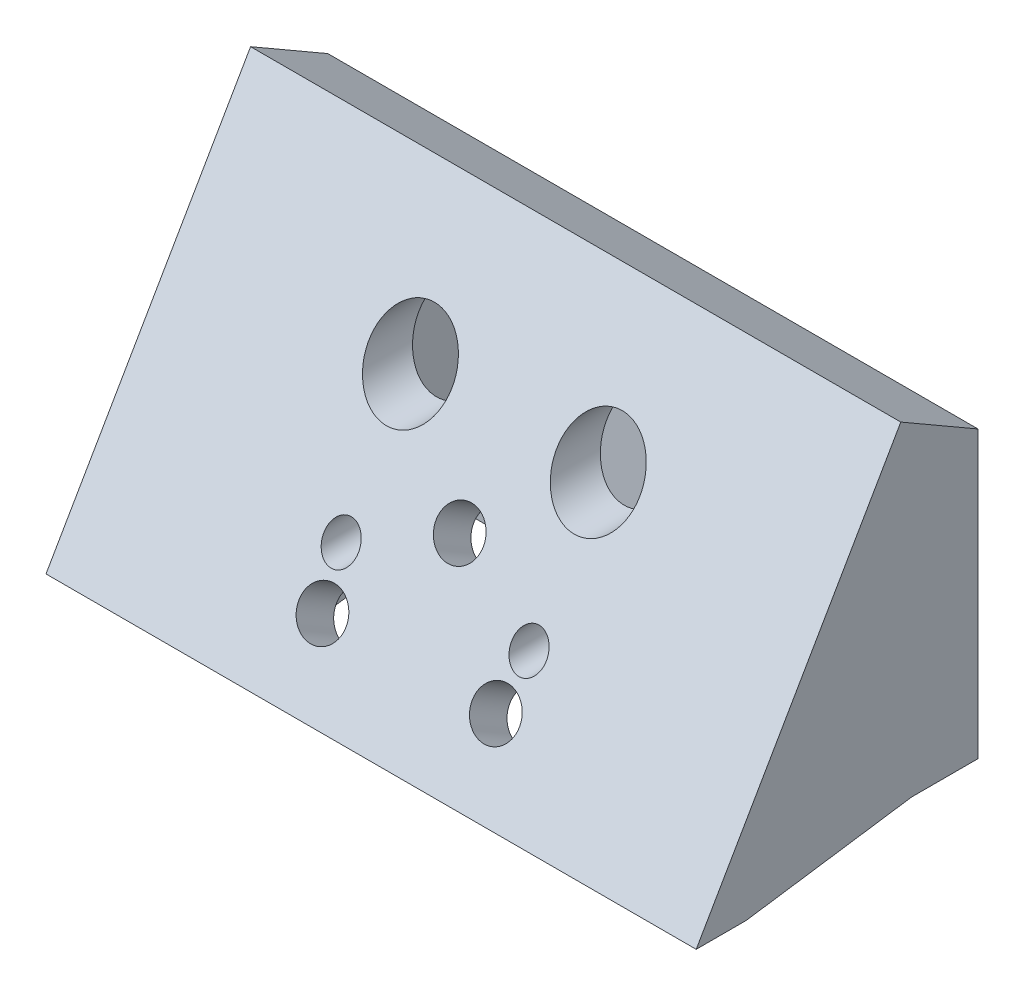
ISO-10303-21;
HEADER;
FILE_DESCRIPTION(('STEP AP214'),'2;1');
FILE_NAME('part.step','',(''),(''),'','','');
FILE_SCHEMA(('AUTOMOTIVE_DESIGN { 1 0 10303 214 1 1 1 1 }'));
ENDSEC;
DATA;
#1=APPLICATION_CONTEXT('core data for automotive mechanical design processes');
#2=APPLICATION_PROTOCOL_DEFINITION('international standard','automotive_design',2000,#1);
#3=PRODUCT_CONTEXT('',#1,'mechanical');
#4=PRODUCT('Part','Part','',(#3));
#5=PRODUCT_RELATED_PRODUCT_CATEGORY('part','',(#4));
#6=PRODUCT_DEFINITION_FORMATION('','',#4);
#7=PRODUCT_DEFINITION_CONTEXT('part definition',#1,'design');
#8=PRODUCT_DEFINITION('design','',#6,#7);
#9=PRODUCT_DEFINITION_SHAPE('','',#8);
#10=(LENGTH_UNIT() NAMED_UNIT(*) SI_UNIT(.MILLI.,.METRE.));
#11=(NAMED_UNIT(*) PLANE_ANGLE_UNIT() SI_UNIT($,.RADIAN.));
#12=(NAMED_UNIT(*) SI_UNIT($,.STERADIAN.) SOLID_ANGLE_UNIT());
#13=UNCERTAINTY_MEASURE_WITH_UNIT(LENGTH_MEASURE(1.E-05),#10,'distance_accuracy_value','');
#14=(GEOMETRIC_REPRESENTATION_CONTEXT(3) GLOBAL_UNCERTAINTY_ASSIGNED_CONTEXT((#13)) GLOBAL_UNIT_ASSIGNED_CONTEXT((#10,
#11,#12)) REPRESENTATION_CONTEXT('',''));
#15=CARTESIAN_POINT('',(0.,0.,0.));
#16=DIRECTION('',(0.,0.,1.));
#17=DIRECTION('',(1.,0.,0.));
#18=AXIS2_PLACEMENT_3D('',#15,#16,#17);
#19=CARTESIAN_POINT('',(20.,3.35000000000049,0.));
#20=DIRECTION('',(0.,-1.,0.));
#21=DIRECTION('',(0.,0.,-1.));
#22=AXIS2_PLACEMENT_3D('',#19,#20,#21);
#23=PLANE('',#22);
#24=DIRECTION('',(-1.,0.,0.));
#25=VECTOR('',#24,1.);
#26=CARTESIAN_POINT('',(20.,3.35000000000048,-26.0785448088665));
#27=LINE('',#26,#25);
#28=CARTESIAN_POINT('',(20.,3.35000000000048,-26.0785448088665));
#29=VERTEX_POINT('',#28);
#30=CARTESIAN_POINT('',(-20.,3.35000000000048,-26.0785448088665));
#31=VERTEX_POINT('',#30);
#32=EDGE_CURVE('E269',#29,#31,#27,.T.);
#33=ORIENTED_EDGE('',*,*,#32,.T.);
#34=DIRECTION('',(0.,0.,1.));
#35=VECTOR('',#34,1.);
#36=CARTESIAN_POINT('',(-20.,3.35000000000049,0.));
#37=LINE('',#36,#35);
#38=CARTESIAN_POINT('',(-20.,3.35000000000048,-22.9035448088665));
#39=VERTEX_POINT('',#38);
#40=EDGE_CURVE('E173',#31,#39,#37,.T.);
#41=ORIENTED_EDGE('',*,*,#40,.T.);
#42=DIRECTION('',(1.,0.,0.));
#43=VECTOR('',#42,1.);
#44=CARTESIAN_POINT('',(-45.,3.35000000000048,-22.9035448088665));
#45=LINE('',#44,#43);
#46=CARTESIAN_POINT('',(-45.,3.35000000000048,-22.9035448088665));
#47=VERTEX_POINT('',#46);
#48=EDGE_CURVE('E166',#47,#39,#45,.T.);
#49=ORIENTED_EDGE('',*,*,#48,.F.);
#50=DIRECTION('',(0.,0.,1.));
#51=VECTOR('',#50,1.);
#52=CARTESIAN_POINT('',(-45.,3.35000000000049,0.));
#53=LINE('',#52,#51);
#54=CARTESIAN_POINT('',(-45.,3.35000000000048,-32.0785448088665));
#55=VERTEX_POINT('',#54);
#56=EDGE_CURVE('E152',#55,#47,#53,.T.);
#57=ORIENTED_EDGE('',*,*,#56,.F.);
#58=DIRECTION('',(-1.,0.,0.));
#59=VECTOR('',#58,1.);
#60=CARTESIAN_POINT('',(20.,3.35000000000048,-32.0785448088665));
#61=LINE('',#60,#59);
#62=CARTESIAN_POINT('',(45.,3.35000000000048,-32.0785448088665));
#63=VERTEX_POINT('',#62);
#64=EDGE_CURVE('E294',#63,#55,#61,.T.);
#65=ORIENTED_EDGE('',*,*,#64,.F.);
#66=DIRECTION('',(0.,0.,-1.));
#67=VECTOR('',#66,1.);
#68=CARTESIAN_POINT('',(45.,3.35000000000049,0.));
#69=LINE('',#68,#67);
#70=CARTESIAN_POINT('',(45.,3.35000000000048,-22.9035448088665));
#71=VERTEX_POINT('',#70);
#72=EDGE_CURVE('E199',#71,#63,#69,.T.);
#73=ORIENTED_EDGE('',*,*,#72,.F.);
#74=DIRECTION('',(-1.,0.,0.));
#75=VECTOR('',#74,1.);
#76=CARTESIAN_POINT('',(45.,3.35000000000048,-22.9035448088665));
#77=LINE('',#76,#75);
#78=CARTESIAN_POINT('',(20.,3.35000000000048,-22.9035448088665));
#79=VERTEX_POINT('',#78);
#80=EDGE_CURVE('E204',#71,#79,#77,.T.);
#81=ORIENTED_EDGE('',*,*,#80,.T.);
#82=DIRECTION('',(0.,0.,-1.));
#83=VECTOR('',#82,1.);
#84=CARTESIAN_POINT('',(20.,3.35000000000049,0.));
#85=LINE('',#84,#83);
#86=EDGE_CURVE('E185',#79,#29,#85,.T.);
#87=ORIENTED_EDGE('',*,*,#86,.T.);
#88=EDGE_LOOP('',(#33,#41,#49,#57,#65,#73,#81,#87));
#89=FACE_BOUND('',#88,.T.);
#90=ADVANCED_FACE('F36',(#89),#23,.T.);
#91=CARTESIAN_POINT('',(20.,0.,-32.0785448088665));
#92=DIRECTION('',(0.,0.,-1.));
#93=DIRECTION('',(0.,1.,0.));
#94=AXIS2_PLACEMENT_3D('',#91,#92,#93);
#95=PLANE('',#94);
#96=CARTESIAN_POINT('',(13.,15.3500000000005,-32.0785448088665));
#97=DIRECTION('',(0.,0.,-1.));
#98=DIRECTION('',(-1.,0.,0.));
#99=AXIS2_PLACEMENT_3D('',#96,#97,#98);
#100=CIRCLE('',#99,2.8067);
#101=CARTESIAN_POINT('',(10.1933,15.3500000000005,-32.0785448088665));
#102=VERTEX_POINT('',#101);
#103=EDGE_CURVE('E245',#102,#102,#100,.T.);
#104=ORIENTED_EDGE('',*,*,#103,.F.);
#105=EDGE_LOOP('',(#104));
#106=FACE_BOUND('',#105,.T.);
#107=CARTESIAN_POINT('',(13.,31.9500000000005,-32.0785448088665));
#108=DIRECTION('',(0.,0.,-1.));
#109=DIRECTION('',(-1.,0.,0.));
#110=AXIS2_PLACEMENT_3D('',#107,#108,#109);
#111=CIRCLE('',#110,2.8067);
#112=CARTESIAN_POINT('',(10.1933,31.9500000000005,-32.0785448088665));
#113=VERTEX_POINT('',#112);
#114=EDGE_CURVE('E249',#113,#113,#111,.T.);
#115=ORIENTED_EDGE('',*,*,#114,.F.);
#116=EDGE_LOOP('',(#115));
#117=FACE_BOUND('',#116,.T.);
#118=CARTESIAN_POINT('',(-13.,31.9500000000005,-32.0785448088665));
#119=DIRECTION('',(0.,0.,-1.));
#120=DIRECTION('',(-1.,0.,0.));
#121=AXIS2_PLACEMENT_3D('',#118,#119,#120);
#122=CIRCLE('',#121,2.8067);
#123=CARTESIAN_POINT('',(-15.8067,31.9500000000005,-32.0785448088665));
#124=VERTEX_POINT('',#123);
#125=EDGE_CURVE('E253',#124,#124,#122,.T.);
#126=ORIENTED_EDGE('',*,*,#125,.F.);
#127=EDGE_LOOP('',(#126));
#128=FACE_BOUND('',#127,.T.);
#129=CARTESIAN_POINT('',(-13.,15.3500000000005,-32.0785448088665));
#130=DIRECTION('',(0.,0.,-1.));
#131=DIRECTION('',(-1.,0.,0.));
#132=AXIS2_PLACEMENT_3D('',#129,#130,#131);
#133=CIRCLE('',#132,2.8067);
#134=CARTESIAN_POINT('',(-15.8067,15.3500000000005,-32.0785448088665));
#135=VERTEX_POINT('',#134);
#136=EDGE_CURVE('E257',#135,#135,#133,.T.);
#137=ORIENTED_EDGE('',*,*,#136,.F.);
#138=EDGE_LOOP('',(#137));
#139=FACE_BOUND('',#138,.T.);
#140=ORIENTED_EDGE('',*,*,#64,.T.);
#141=DIRECTION('',(0.,-1.,0.));
#142=VECTOR('',#141,1.);
#143=CARTESIAN_POINT('',(-45.,0.,-32.0785448088665));
#144=LINE('',#143,#142);
#145=CARTESIAN_POINT('',(-45.,42.8764973081042,-32.0785448088665));
#146=VERTEX_POINT('',#145);
#147=EDGE_CURVE('E178',#146,#55,#144,.T.);
#148=ORIENTED_EDGE('',*,*,#147,.F.);
#149=DIRECTION('',(-1.,0.,0.));
#150=VECTOR('',#149,1.);
#151=CARTESIAN_POINT('',(20.,42.8764973081042,-32.0785448088665));
#152=LINE('',#151,#150);
#153=CARTESIAN_POINT('',(45.,42.8764973081042,-32.0785448088665));
#154=VERTEX_POINT('',#153);
#155=EDGE_CURVE('E292',#154,#146,#152,.T.);
#156=ORIENTED_EDGE('',*,*,#155,.F.);
#157=DIRECTION('',(0.,1.,0.));
#158=VECTOR('',#157,1.);
#159=CARTESIAN_POINT('',(45.,0.,-32.0785448088665));
#160=LINE('',#159,#158);
#161=EDGE_CURVE('E196',#63,#154,#160,.T.);
#162=ORIENTED_EDGE('',*,*,#161,.F.);
#163=EDGE_LOOP('',(#140,#148,#156,#162));
#164=FACE_BOUND('',#163,.T.);
#165=ADVANCED_FACE('F346',(#106,#117,#128,#139,#164),#95,.T.);
#166=CARTESIAN_POINT('',(20.,46.0477903415361,-26.5857041492732));
#167=DIRECTION('',(0.,-0.86602540378444,0.499999999999998));
#168=DIRECTION('',(0.,-0.499999999999998,-0.86602540378444));
#169=AXIS2_PLACEMENT_3D('',#166,#167,#168);
#170=PLANE('',#169);
#171=ORIENTED_EDGE('',*,*,#155,.T.);
#172=DIRECTION('',(0.,0.499999999999998,0.86602540378444));
#173=VECTOR('',#172,1.);
#174=CARTESIAN_POINT('',(-45.,46.0477903415361,-26.5857041492732));
#175=LINE('',#174,#173);
#176=CARTESIAN_POINT('',(-45.,49.0477903415362,-21.3895517265665));
#177=VERTEX_POINT('',#176);
#178=EDGE_CURVE('E180',#146,#177,#175,.T.);
#179=ORIENTED_EDGE('',*,*,#178,.T.);
#180=DIRECTION('',(-1.,0.,0.));
#181=VECTOR('',#180,1.);
#182=CARTESIAN_POINT('',(20.,49.0477903415361,-21.3895517265665));
#183=LINE('',#182,#181);
#184=CARTESIAN_POINT('',(45.,49.0477903415361,-21.3895517265665));
#185=VERTEX_POINT('',#184);
#186=EDGE_CURVE('E290',#185,#177,#183,.T.);
#187=ORIENTED_EDGE('',*,*,#186,.F.);
#188=DIRECTION('',(0.,-0.499999999999998,-0.86602540378444));
#189=VECTOR('',#188,1.);
#190=CARTESIAN_POINT('',(45.,46.0477903415361,-26.5857041492732));
#191=LINE('',#190,#189);
#192=EDGE_CURVE('E193',#185,#154,#191,.T.);
#193=ORIENTED_EDGE('',*,*,#192,.T.);
#194=EDGE_LOOP('',(#171,#179,#187,#193));
#195=FACE_BOUND('',#194,.T.);
#196=ADVANCED_FACE('F351',(#195),#170,.F.);
#197=CARTESIAN_POINT('',(20.,3.00000000000003,5.19615242270671));
#198=DIRECTION('',(0.,0.499999999999998,0.86602540378444));
#199=DIRECTION('',(0.,-0.86602540378444,0.499999999999998));
#200=AXIS2_PLACEMENT_3D('',#197,#198,#199);
#201=PLANE('',#200);
#202=CARTESIAN_POINT('',(12.,9.12435565298219,1.66025403784448));
#203=DIRECTION('',(0.,0.499999999999998,0.86602540378444));
#204=DIRECTION('',(0.,-0.86602540378444,0.499999999999998));
#205=AXIS2_PLACEMENT_3D('',#202,#203,#204);
#206=CIRCLE('',#205,3.2639);
#207=CARTESIAN_POINT('',(12.,6.29773533757015,3.29220403784447));
#208=VERTEX_POINT('',#207);
#209=EDGE_CURVE('E212',#208,#208,#206,.T.);
#210=ORIENTED_EDGE('',*,*,#209,.F.);
#211=EDGE_LOOP('',(#210));
#212=FACE_BOUND('',#211,.T.);
#213=CARTESIAN_POINT('',(-12.,9.12435565298219,1.66025403784448));
#214=DIRECTION('',(0.,0.499999999999998,0.86602540378444));
#215=DIRECTION('',(0.,-0.86602540378444,0.499999999999998));
#216=AXIS2_PLACEMENT_3D('',#213,#214,#215);
#217=CIRCLE('',#216,3.2639);
#218=CARTESIAN_POINT('',(-12.,6.29773533757015,3.29220403784447));
#219=VERTEX_POINT('',#218);
#220=EDGE_CURVE('E216',#219,#219,#217,.T.);
#221=ORIENTED_EDGE('',*,*,#220,.F.);
#222=EDGE_LOOP('',(#221));
#223=FACE_BOUND('',#222,.T.);
#224=CARTESIAN_POINT('',(0.,21.2487113059643,-5.33974596215549));
#225=DIRECTION('',(0.,0.499999999999998,0.86602540378444));
#226=DIRECTION('',(0.,-0.86602540378444,0.499999999999998));
#227=AXIS2_PLACEMENT_3D('',#224,#225,#226);
#228=CIRCLE('',#227,3.2639);
#229=CARTESIAN_POINT('',(0.,18.4220909905523,-3.7077959621555));
#230=VERTEX_POINT('',#229);
#231=EDGE_CURVE('E220',#230,#230,#228,.T.);
#232=ORIENTED_EDGE('',*,*,#231,.F.);
#233=EDGE_LOOP('',(#232));
#234=FACE_BOUND('',#233,.T.);
#235=CARTESIAN_POINT('',(13.,31.9500000000005,-11.5181378703331));
#236=DIRECTION('',(0.,0.499999999999998,0.86602540378444));
#237=DIRECTION('',(0.,0.86602540378444,-0.499999999999998));
#238=AXIS2_PLACEMENT_3D('',#235,#236,#237);
#239=ELLIPSE('',#238,6.63952809568069,5.75);
#240=CARTESIAN_POINT('',(13.,37.7000000000005,-14.8379019181735));
#241=VERTEX_POINT('',#240);
#242=EDGE_CURVE('E227',#241,#241,#239,.T.);
#243=ORIENTED_EDGE('',*,*,#242,.F.);
#244=EDGE_LOOP('',(#243));
#245=FACE_BOUND('',#244,.T.);
#246=CARTESIAN_POINT('',(-13.,31.9500000000005,-11.5181378703331));
#247=DIRECTION('',(0.,0.499999999999998,0.86602540378444));
#248=DIRECTION('',(0.,0.86602540378444,-0.499999999999998));
#249=AXIS2_PLACEMENT_3D('',#246,#247,#248);
#250=ELLIPSE('',#249,6.63952809568069,5.75);
#251=CARTESIAN_POINT('',(-13.,37.7000000000005,-14.8379019181735));
#252=VERTEX_POINT('',#251);
#253=EDGE_CURVE('E234',#252,#252,#250,.T.);
#254=ORIENTED_EDGE('',*,*,#253,.F.);
#255=EDGE_LOOP('',(#254));
#256=FACE_BOUND('',#255,.T.);
#257=CARTESIAN_POINT('',(-13.,15.3500000000005,-1.93412340178539));
#258=DIRECTION('',(0.,0.499999999999998,0.86602540378444));
#259=DIRECTION('',(0.,0.86602540378444,-0.499999999999998));
#260=AXIS2_PLACEMENT_3D('',#257,#258,#259);
#261=ELLIPSE('',#260,2.77128129211019,2.39999999999999);
#262=CARTESIAN_POINT('',(-13.,17.7500000000005,-3.31976404784048));
#263=VERTEX_POINT('',#262);
#264=EDGE_CURVE('E238',#263,#263,#261,.T.);
#265=ORIENTED_EDGE('',*,*,#264,.F.);
#266=EDGE_LOOP('',(#265));
#267=FACE_BOUND('',#266,.T.);
#268=CARTESIAN_POINT('',(13.,15.3500000000005,-1.93412340178539));
#269=DIRECTION('',(0.,0.499999999999998,0.86602540378444));
#270=DIRECTION('',(0.,0.86602540378444,-0.499999999999998));
#271=AXIS2_PLACEMENT_3D('',#268,#269,#270);
#272=ELLIPSE('',#271,2.77128129211019,2.39999999999999);
#273=CARTESIAN_POINT('',(13.,17.7500000000005,-3.31976404784048));
#274=VERTEX_POINT('',#273);
#275=EDGE_CURVE('E242',#274,#274,#272,.T.);
#276=ORIENTED_EDGE('',*,*,#275,.F.);
#277=EDGE_LOOP('',(#276));
#278=FACE_BOUND('',#277,.T.);
#279=ORIENTED_EDGE('',*,*,#186,.T.);
#280=DIRECTION('',(0.,0.86602540378444,-0.499999999999998));
#281=VECTOR('',#280,1.);
#282=CARTESIAN_POINT('',(-45.,3.00000000000003,5.19615242270671));
#283=LINE('',#282,#281);
#284=CARTESIAN_POINT('',(-45.,0.,6.9282032302756));
#285=VERTEX_POINT('',#284);
#286=EDGE_CURVE('E167',#285,#177,#283,.T.);
#287=ORIENTED_EDGE('',*,*,#286,.F.);
#288=DIRECTION('',(-1.,0.,0.));
#289=VECTOR('',#288,1.);
#290=CARTESIAN_POINT('',(20.,0.,6.9282032302756));
#291=LINE('',#290,#289);
#292=CARTESIAN_POINT('',(45.,0.,6.9282032302756));
#293=VERTEX_POINT('',#292);
#294=EDGE_CURVE('E171',#293,#285,#291,.T.);
#295=ORIENTED_EDGE('',*,*,#294,.F.);
#296=DIRECTION('',(0.,-0.86602540378444,0.499999999999998));
#297=VECTOR('',#296,1.);
#298=CARTESIAN_POINT('',(45.,3.00000000000003,5.19615242270671));
#299=LINE('',#298,#297);
#300=EDGE_CURVE('E189',#185,#293,#299,.T.);
#301=ORIENTED_EDGE('',*,*,#300,.F.);
#302=EDGE_LOOP('',(#279,#287,#295,#301));
#303=FACE_BOUND('',#302,.T.);
#304=ADVANCED_FACE('F378',(#212,#223,#234,#245,#256,#267,#278,#303),#201,.T.);
#305=CARTESIAN_POINT('',(20.,0.,0.));
#306=DIRECTION('',(0.,1.,0.));
#307=DIRECTION('',(0.,0.,1.));
#308=AXIS2_PLACEMENT_3D('',#305,#306,#307);
#309=PLANE('',#308);
#310=ORIENTED_EDGE('',*,*,#294,.T.);
#311=DIRECTION('',(0.,0.,-1.));
#312=VECTOR('',#311,1.);
#313=CARTESIAN_POINT('',(-45.,0.,0.));
#314=LINE('',#313,#312);
#315=CARTESIAN_POINT('',(-45.,0.,0.));
#316=VERTEX_POINT('',#315);
#317=EDGE_CURVE('E149',#285,#316,#314,.T.);
#318=ORIENTED_EDGE('',*,*,#317,.T.);
#319=DIRECTION('',(1.,0.,0.));
#320=VECTOR('',#319,1.);
#321=CARTESIAN_POINT('',(-45.,0.,0.));
#322=LINE('',#321,#320);
#323=CARTESIAN_POINT('',(-20.,0.,0.));
#324=VERTEX_POINT('',#323);
#325=EDGE_CURVE('E159',#316,#324,#322,.T.);
#326=ORIENTED_EDGE('',*,*,#325,.T.);
#327=DIRECTION('',(-1.,0.,0.));
#328=VECTOR('',#327,1.);
#329=CARTESIAN_POINT('',(20.,0.,0.));
#330=LINE('',#329,#328);
#331=CARTESIAN_POINT('',(20.,0.,0.));
#332=VERTEX_POINT('',#331);
#333=EDGE_CURVE('E286',#332,#324,#330,.T.);
#334=ORIENTED_EDGE('',*,*,#333,.F.);
#335=DIRECTION('',(-1.,0.,0.));
#336=VECTOR('',#335,1.);
#337=CARTESIAN_POINT('',(45.,0.,0.));
#338=LINE('',#337,#336);
#339=CARTESIAN_POINT('',(45.,0.,0.));
#340=VERTEX_POINT('',#339);
#341=EDGE_CURVE('E208',#340,#332,#338,.T.);
#342=ORIENTED_EDGE('',*,*,#341,.F.);
#343=DIRECTION('',(0.,0.,1.));
#344=VECTOR('',#343,1.);
#345=CARTESIAN_POINT('',(45.,0.,0.));
#346=LINE('',#345,#344);
#347=EDGE_CURVE('E187',#340,#293,#346,.T.);
#348=ORIENTED_EDGE('',*,*,#347,.T.);
#349=EDGE_LOOP('',(#310,#318,#326,#334,#342,#348));
#350=FACE_BOUND('',#349,.T.);
#351=ADVANCED_FACE('F169',(#350),#309,.F.);
#352=CARTESIAN_POINT('',(20.,0.,0.));
#353=DIRECTION('',(0.,0.499999999999996,0.866025403784441));
#354=DIRECTION('',(0.,-0.866025403784441,0.499999999999996));
#355=AXIS2_PLACEMENT_3D('',#352,#353,#354);
#356=PLANE('',#355);
#357=CARTESIAN_POINT('',(12.,6.12435565298217,-3.53589838486222));
#358=DIRECTION('',(0.,0.499999999999996,0.866025403784441));
#359=DIRECTION('',(0.,-0.866025403784441,0.499999999999996));
#360=AXIS2_PLACEMENT_3D('',#357,#358,#359);
#361=CIRCLE('',#360,3.2639);
#362=CARTESIAN_POINT('',(12.,3.29773533757013,-1.90394838486223));
#363=VERTEX_POINT('',#362);
#364=EDGE_CURVE('E39',#363,#363,#361,.T.);
#365=ORIENTED_EDGE('',*,*,#364,.T.);
#366=EDGE_LOOP('',(#365));
#367=FACE_BOUND('',#366,.T.);
#368=CARTESIAN_POINT('',(-12.,6.12435565298217,-3.53589838486222));
#369=DIRECTION('',(0.,0.499999999999996,0.866025403784441));
#370=DIRECTION('',(0.,-0.866025403784441,0.499999999999996));
#371=AXIS2_PLACEMENT_3D('',#368,#369,#370);
#372=CIRCLE('',#371,3.2639);
#373=CARTESIAN_POINT('',(-12.,3.29773533757013,-1.90394838486223));
#374=VERTEX_POINT('',#373);
#375=EDGE_CURVE('E215',#374,#374,#372,.T.);
#376=ORIENTED_EDGE('',*,*,#375,.T.);
#377=EDGE_LOOP('',(#376));
#378=FACE_BOUND('',#377,.T.);
#379=CARTESIAN_POINT('',(0.,18.2487113059643,-10.5358983848622));
#380=DIRECTION('',(0.,0.499999999999996,0.866025403784441));
#381=DIRECTION('',(0.,-0.866025403784441,0.499999999999996));
#382=AXIS2_PLACEMENT_3D('',#379,#380,#381);
#383=CIRCLE('',#382,3.2639);
#384=CARTESIAN_POINT('',(0.,15.4220909905523,-8.90394838486218));
#385=VERTEX_POINT('',#384);
#386=EDGE_CURVE('E219',#385,#385,#383,.T.);
#387=ORIENTED_EDGE('',*,*,#386,.T.);
#388=EDGE_LOOP('',(#387));
#389=FACE_BOUND('',#388,.T.);
#390=CARTESIAN_POINT('',(-13.,15.3500000000005,-8.86232663206094));
#391=DIRECTION('',(0.,0.499999999999996,0.866025403784441));
#392=DIRECTION('',(0.,0.866025403784441,-0.499999999999996));
#393=AXIS2_PLACEMENT_3D('',#390,#391,#392);
#394=ELLIPSE('',#393,2.77128129211019,2.39999999999999);
#395=CARTESIAN_POINT('',(-13.,17.7500000000005,-10.247967278116));
#396=VERTEX_POINT('',#395);
#397=EDGE_CURVE('E237',#396,#396,#394,.T.);
#398=ORIENTED_EDGE('',*,*,#397,.T.);
#399=EDGE_LOOP('',(#398));
#400=FACE_BOUND('',#399,.T.);
#401=CARTESIAN_POINT('',(13.,15.3500000000005,-8.86232663206094));
#402=DIRECTION('',(0.,0.499999999999996,0.866025403784441));
#403=DIRECTION('',(0.,0.866025403784441,-0.499999999999996));
#404=AXIS2_PLACEMENT_3D('',#401,#402,#403);
#405=ELLIPSE('',#404,2.77128129211019,2.39999999999999);
#406=CARTESIAN_POINT('',(13.,17.7500000000005,-10.247967278116));
#407=VERTEX_POINT('',#406);
#408=EDGE_CURVE('E241',#407,#407,#405,.T.);
#409=ORIENTED_EDGE('',*,*,#408,.T.);
#410=EDGE_LOOP('',(#409));
#411=FACE_BOUND('',#410,.T.);
#412=DIRECTION('',(-1.,0.,0.));
#413=VECTOR('',#412,1.);
#414=CARTESIAN_POINT('',(20.,37.5764973081042,-21.694800836037));
#415=LINE('',#414,#413);
#416=CARTESIAN_POINT('',(11.8146612121835,37.5764973081042,-21.694800836037));
#417=VERTEX_POINT('',#416);
#418=CARTESIAN_POINT('',(-11.8146612121838,37.5764973081042,-21.694800836037));
#419=VERTEX_POINT('',#418);
#420=EDGE_CURVE('E287',#417,#419,#415,.T.);
#421=ORIENTED_EDGE('',*,*,#420,.F.);
#422=CARTESIAN_POINT('',(13.,31.9500000000005,-18.4463411006086));
#423=DIRECTION('',(0.,0.499999999999996,0.866025403784441));
#424=DIRECTION('',(0.,0.866025403784441,-0.499999999999996));
#425=AXIS2_PLACEMENT_3D('',#422,#423,#424);
#426=ELLIPSE('',#425,6.63952809568068,5.75);
#427=CARTESIAN_POINT('',(14.1853387878162,37.5764973081042,-21.694800836037));
#428=VERTEX_POINT('',#427);
#429=EDGE_CURVE('E224',#417,#428,#426,.T.);
#430=ORIENTED_EDGE('',*,*,#429,.T.);
#431=CARTESIAN_POINT('',(20.,37.5764973081042,-21.694800836037));
#432=VERTEX_POINT('',#431);
#433=EDGE_CURVE('E283',#432,#428,#415,.T.);
#434=ORIENTED_EDGE('',*,*,#433,.F.);
#435=DIRECTION('',(0.,0.866025403784441,-0.499999999999996));
#436=VECTOR('',#435,1.);
#437=CARTESIAN_POINT('',(20.,0.,0.));
#438=LINE('',#437,#436);
#439=EDGE_CURVE('E261',#332,#432,#438,.T.);
#440=ORIENTED_EDGE('',*,*,#439,.F.);
#441=ORIENTED_EDGE('',*,*,#333,.T.);
#442=DIRECTION('',(0.,0.866025403784441,-0.499999999999996));
#443=VECTOR('',#442,1.);
#444=CARTESIAN_POINT('',(-20.,0.,0.));
#445=LINE('',#444,#443);
#446=CARTESIAN_POINT('',(-20.,37.5764973081042,-21.694800836037));
#447=VERTEX_POINT('',#446);
#448=EDGE_CURVE('E270',#324,#447,#445,.T.);
#449=ORIENTED_EDGE('',*,*,#448,.T.);
#450=CARTESIAN_POINT('',(-14.1853387878164,37.5764973081042,-21.694800836037));
#451=VERTEX_POINT('',#450);
#452=EDGE_CURVE('E282',#451,#447,#415,.T.);
#453=ORIENTED_EDGE('',*,*,#452,.F.);
#454=CARTESIAN_POINT('',(-13.,31.9500000000005,-18.4463411006086));
#455=DIRECTION('',(0.,0.499999999999996,0.866025403784441));
#456=DIRECTION('',(0.,0.866025403784441,-0.499999999999996));
#457=AXIS2_PLACEMENT_3D('',#454,#455,#456);
#458=ELLIPSE('',#457,6.63952809568068,5.75);
#459=EDGE_CURVE('E231',#451,#419,#458,.T.);
#460=ORIENTED_EDGE('',*,*,#459,.T.);
#461=EDGE_LOOP('',(#421,#430,#434,#440,#441,#449,#453,#460));
#462=FACE_BOUND('',#461,.T.);
#463=ADVANCED_FACE('F326',(#367,#378,#389,#400,#411,#462),#356,.F.);
#464=CARTESIAN_POINT('',(20.,37.5764973081043,-2.15710964407993E-13));
#465=DIRECTION('',(0.,1.,0.));
#466=DIRECTION('',(0.,0.,1.));
#467=AXIS2_PLACEMENT_3D('',#464,#465,#466);
#468=PLANE('',#467);
#469=ORIENTED_EDGE('',*,*,#433,.T.);
#470=DIRECTION('',(0.,0.,-1.));
#471=VECTOR('',#470,1.);
#472=CARTESIAN_POINT('',(14.1853387878165,37.5764973081042,-32.0785448088665));
#473=LINE('',#472,#471);
#474=CARTESIAN_POINT('',(14.1853387878162,37.5764973081042,-22.9035448088665));
#475=VERTEX_POINT('',#474);
#476=EDGE_CURVE('E11',#428,#475,#473,.T.);
#477=ORIENTED_EDGE('',*,*,#476,.T.);
#478=DIRECTION('',(-1.,0.,0.));
#479=VECTOR('',#478,1.);
#480=CARTESIAN_POINT('',(20.,37.5764973081042,-22.9035448088665));
#481=LINE('',#480,#479);
#482=CARTESIAN_POINT('',(11.8146612121838,37.5764973081042,-22.9035448088665));
#483=VERTEX_POINT('',#482);
#484=EDGE_CURVE('E317',#475,#483,#481,.T.);
#485=ORIENTED_EDGE('',*,*,#484,.T.);
#486=DIRECTION('',(0.,0.,-1.));
#487=VECTOR('',#486,1.);
#488=CARTESIAN_POINT('',(11.8146612121835,37.5764973081042,-32.0785448088665));
#489=LINE('',#488,#487);
#490=EDGE_CURVE('E44',#483,#417,#489,.F.);
#491=ORIENTED_EDGE('',*,*,#490,.T.);
#492=ORIENTED_EDGE('',*,*,#420,.T.);
#493=DIRECTION('',(0.,0.,-1.));
#494=VECTOR('',#493,1.);
#495=CARTESIAN_POINT('',(-11.8146612121836,37.5764973081042,-32.0785448088665));
#496=LINE('',#495,#494);
#497=CARTESIAN_POINT('',(-11.8146612121838,37.5764973081042,-22.9035448088665));
#498=VERTEX_POINT('',#497);
#499=EDGE_CURVE('E314',#419,#498,#496,.T.);
#500=ORIENTED_EDGE('',*,*,#499,.T.);
#501=DIRECTION('',(-1.,0.,0.));
#502=VECTOR('',#501,1.);
#503=CARTESIAN_POINT('',(20.,37.5764973081042,-22.9035448088665));
#504=LINE('',#503,#502);
#505=CARTESIAN_POINT('',(-14.1853387878162,37.5764973081042,-22.9035448088665));
#506=VERTEX_POINT('',#505);
#507=EDGE_CURVE('E296',#498,#506,#504,.T.);
#508=ORIENTED_EDGE('',*,*,#507,.T.);
#509=DIRECTION('',(0.,0.,-1.));
#510=VECTOR('',#509,1.);
#511=CARTESIAN_POINT('',(-14.1853387878164,37.5764973081042,-32.0785448088665));
#512=LINE('',#511,#510);
#513=EDGE_CURVE('E311',#506,#451,#512,.F.);
#514=ORIENTED_EDGE('',*,*,#513,.T.);
#515=ORIENTED_EDGE('',*,*,#452,.T.);
#516=DIRECTION('',(0.,0.,-1.));
#517=VECTOR('',#516,1.);
#518=CARTESIAN_POINT('',(-20.,37.5764973081043,-2.15710964407993E-13));
#519=LINE('',#518,#517);
#520=CARTESIAN_POINT('',(-20.,37.5764973081042,-26.0785448088665));
#521=VERTEX_POINT('',#520);
#522=EDGE_CURVE('E273',#447,#521,#519,.T.);
#523=ORIENTED_EDGE('',*,*,#522,.T.);
#524=DIRECTION('',(-1.,0.,0.));
#525=VECTOR('',#524,1.);
#526=CARTESIAN_POINT('',(20.,37.5764973081042,-26.0785448088665));
#527=LINE('',#526,#525);
#528=CARTESIAN_POINT('',(20.,37.5764973081042,-26.0785448088665));
#529=VERTEX_POINT('',#528);
#530=EDGE_CURVE('E279',#529,#521,#527,.T.);
#531=ORIENTED_EDGE('',*,*,#530,.F.);
#532=DIRECTION('',(0.,0.,-1.));
#533=VECTOR('',#532,1.);
#534=CARTESIAN_POINT('',(20.,37.5764973081043,-2.15710964407993E-13));
#535=LINE('',#534,#533);
#536=EDGE_CURVE('E263',#432,#529,#535,.T.);
#537=ORIENTED_EDGE('',*,*,#536,.F.);
#538=EDGE_LOOP('',(#469,#477,#485,#491,#492,#500,#508,#514,#515,#523,#531,#537));
#539=FACE_BOUND('',#538,.T.);
#540=ADVANCED_FACE('F388',(#539),#468,.F.);
#541=CARTESIAN_POINT('',(20.,0.,-26.0785448088665));
#542=DIRECTION('',(0.,0.,1.));
#543=DIRECTION('',(0.,-1.,0.));
#544=AXIS2_PLACEMENT_3D('',#541,#542,#543);
#545=PLANE('',#544);
#546=CARTESIAN_POINT('',(13.,15.3500000000005,-26.0785448088665));
#547=DIRECTION('',(0.,0.,1.));
#548=DIRECTION('',(0.,-1.,0.));
#549=AXIS2_PLACEMENT_3D('',#546,#547,#548);
#550=CIRCLE('',#549,2.8067);
#551=CARTESIAN_POINT('',(13.,12.5433000000005,-26.0785448088665));
#552=VERTEX_POINT('',#551);
#553=EDGE_CURVE('E248',#552,#552,#550,.T.);
#554=ORIENTED_EDGE('',*,*,#553,.F.);
#555=EDGE_LOOP('',(#554));
#556=FACE_BOUND('',#555,.T.);
#557=CARTESIAN_POINT('',(13.,31.9500000000005,-26.0785448088665));
#558=DIRECTION('',(0.,0.,1.));
#559=DIRECTION('',(0.,-1.,0.));
#560=AXIS2_PLACEMENT_3D('',#557,#558,#559);
#561=CIRCLE('',#560,2.8067);
#562=CARTESIAN_POINT('',(13.,29.1433000000005,-26.0785448088665));
#563=VERTEX_POINT('',#562);
#564=EDGE_CURVE('E252',#563,#563,#561,.T.);
#565=ORIENTED_EDGE('',*,*,#564,.F.);
#566=EDGE_LOOP('',(#565));
#567=FACE_BOUND('',#566,.T.);
#568=CARTESIAN_POINT('',(-13.,31.9500000000005,-26.0785448088665));
#569=DIRECTION('',(0.,0.,1.));
#570=DIRECTION('',(0.,-1.,0.));
#571=AXIS2_PLACEMENT_3D('',#568,#569,#570);
#572=CIRCLE('',#571,2.8067);
#573=CARTESIAN_POINT('',(-13.,29.1433000000005,-26.0785448088665));
#574=VERTEX_POINT('',#573);
#575=EDGE_CURVE('E256',#574,#574,#572,.T.);
#576=ORIENTED_EDGE('',*,*,#575,.F.);
#577=EDGE_LOOP('',(#576));
#578=FACE_BOUND('',#577,.T.);
#579=CARTESIAN_POINT('',(-13.,15.3500000000005,-26.0785448088665));
#580=DIRECTION('',(0.,0.,1.));
#581=DIRECTION('',(0.,-1.,0.));
#582=AXIS2_PLACEMENT_3D('',#579,#580,#581);
#583=CIRCLE('',#582,2.8067);
#584=CARTESIAN_POINT('',(-13.,12.5433000000005,-26.0785448088665));
#585=VERTEX_POINT('',#584);
#586=EDGE_CURVE('E260',#585,#585,#583,.T.);
#587=ORIENTED_EDGE('',*,*,#586,.F.);
#588=EDGE_LOOP('',(#587));
#589=FACE_BOUND('',#588,.T.);
#590=DIRECTION('',(0.,1.,0.));
#591=VECTOR('',#590,1.);
#592=CARTESIAN_POINT('',(-20.,0.,-26.0785448088665));
#593=LINE('',#592,#591);
#594=EDGE_CURVE('E264',#31,#521,#593,.T.);
#595=ORIENTED_EDGE('',*,*,#594,.F.);
#596=ORIENTED_EDGE('',*,*,#32,.F.);
#597=DIRECTION('',(0.,1.,0.));
#598=VECTOR('',#597,1.);
#599=CARTESIAN_POINT('',(20.,0.,-26.0785448088665));
#600=LINE('',#599,#598);
#601=EDGE_CURVE('E266',#29,#529,#600,.T.);
#602=ORIENTED_EDGE('',*,*,#601,.T.);
#603=ORIENTED_EDGE('',*,*,#530,.T.);
#604=EDGE_LOOP('',(#595,#596,#602,#603));
#605=FACE_BOUND('',#604,.T.);
#606=ADVANCED_FACE('F357',(#556,#567,#578,#589,#605),#545,.T.);
#607=CARTESIAN_POINT('',(-13.,15.3500000000005,-32.0785448088665));
#608=DIRECTION('',(0.,0.,-1.));
#609=DIRECTION('',(-1.,0.,0.));
#610=AXIS2_PLACEMENT_3D('',#607,#608,#609);
#611=CYLINDRICAL_SURFACE('',#610,2.8067);
#612=ORIENTED_EDGE('',*,*,#586,.T.);
#613=EDGE_LOOP('',(#612));
#614=FACE_BOUND('',#613,.T.);
#615=ORIENTED_EDGE('',*,*,#136,.T.);
#616=EDGE_LOOP('',(#615));
#617=FACE_BOUND('',#616,.T.);
#618=ADVANCED_FACE('F425',(#614,#617),#611,.F.);
#619=CARTESIAN_POINT('',(-13.,31.9500000000005,-32.0785448088665));
#620=DIRECTION('',(0.,0.,-1.));
#621=DIRECTION('',(-1.,0.,0.));
#622=AXIS2_PLACEMENT_3D('',#619,#620,#621);
#623=CYLINDRICAL_SURFACE('',#622,2.8067);
#624=ORIENTED_EDGE('',*,*,#575,.T.);
#625=EDGE_LOOP('',(#624));
#626=FACE_BOUND('',#625,.T.);
#627=ORIENTED_EDGE('',*,*,#125,.T.);
#628=EDGE_LOOP('',(#627));
#629=FACE_BOUND('',#628,.T.);
#630=ADVANCED_FACE('F421',(#626,#629),#623,.F.);
#631=CARTESIAN_POINT('',(13.,31.9500000000005,-32.0785448088665));
#632=DIRECTION('',(0.,0.,-1.));
#633=DIRECTION('',(-1.,0.,0.));
#634=AXIS2_PLACEMENT_3D('',#631,#632,#633);
#635=CYLINDRICAL_SURFACE('',#634,2.8067);
#636=ORIENTED_EDGE('',*,*,#564,.T.);
#637=EDGE_LOOP('',(#636));
#638=FACE_BOUND('',#637,.T.);
#639=ORIENTED_EDGE('',*,*,#114,.T.);
#640=EDGE_LOOP('',(#639));
#641=FACE_BOUND('',#640,.T.);
#642=ADVANCED_FACE('F417',(#638,#641),#635,.F.);
#643=CARTESIAN_POINT('',(13.,15.3500000000005,-32.0785448088665));
#644=DIRECTION('',(0.,0.,-1.));
#645=DIRECTION('',(-1.,0.,0.));
#646=AXIS2_PLACEMENT_3D('',#643,#644,#645);
#647=CYLINDRICAL_SURFACE('',#646,2.8067);
#648=ORIENTED_EDGE('',*,*,#553,.T.);
#649=EDGE_LOOP('',(#648));
#650=FACE_BOUND('',#649,.T.);
#651=ORIENTED_EDGE('',*,*,#103,.T.);
#652=EDGE_LOOP('',(#651));
#653=FACE_BOUND('',#652,.T.);
#654=ADVANCED_FACE('F413',(#650,#653),#647,.F.);
#655=CARTESIAN_POINT('',(13.,15.3500000000005,-32.0785448088665));
#656=DIRECTION('',(0.,0.,-1.));
#657=DIRECTION('',(-1.,0.,0.));
#658=AXIS2_PLACEMENT_3D('',#655,#656,#657);
#659=CYLINDRICAL_SURFACE('',#658,2.39999999999999);
#660=ORIENTED_EDGE('',*,*,#275,.T.);
#661=EDGE_LOOP('',(#660));
#662=FACE_BOUND('',#661,.T.);
#663=ORIENTED_EDGE('',*,*,#408,.F.);
#664=EDGE_LOOP('',(#663));
#665=FACE_BOUND('',#664,.T.);
#666=ADVANCED_FACE('F409',(#662,#665),#659,.F.);
#667=CARTESIAN_POINT('',(-13.,15.3500000000005,-32.0785448088665));
#668=DIRECTION('',(0.,0.,-1.));
#669=DIRECTION('',(-1.,0.,0.));
#670=AXIS2_PLACEMENT_3D('',#667,#668,#669);
#671=CYLINDRICAL_SURFACE('',#670,2.39999999999999);
#672=ORIENTED_EDGE('',*,*,#264,.T.);
#673=EDGE_LOOP('',(#672));
#674=FACE_BOUND('',#673,.T.);
#675=ORIENTED_EDGE('',*,*,#397,.F.);
#676=EDGE_LOOP('',(#675));
#677=FACE_BOUND('',#676,.T.);
#678=ADVANCED_FACE('F402',(#674,#677),#671,.F.);
#679=CARTESIAN_POINT('',(-13.,31.9500000000005,-32.0785448088665));
#680=DIRECTION('',(0.,0.,-1.));
#681=DIRECTION('',(-1.,0.,0.));
#682=AXIS2_PLACEMENT_3D('',#679,#680,#681);
#683=CYLINDRICAL_SURFACE('',#682,5.75);
#684=ORIENTED_EDGE('',*,*,#253,.T.);
#685=EDGE_LOOP('',(#684));
#686=FACE_BOUND('',#685,.T.);
#687=ORIENTED_EDGE('',*,*,#459,.F.);
#688=ORIENTED_EDGE('',*,*,#513,.F.);
#689=CARTESIAN_POINT('',(-13.,31.9500000000005,-22.9035448088665));
#690=DIRECTION('',(0.,0.,-1.));
#691=DIRECTION('',(-1.,0.,0.));
#692=AXIS2_PLACEMENT_3D('',#689,#690,#691);
#693=CIRCLE('',#692,5.75);
#694=EDGE_CURVE('E58',#506,#498,#693,.T.);
#695=ORIENTED_EDGE('',*,*,#694,.T.);
#696=ORIENTED_EDGE('',*,*,#499,.F.);
#697=EDGE_LOOP('',(#687,#688,#695,#696));
#698=FACE_BOUND('',#697,.T.);
#699=ADVANCED_FACE('F391',(#686,#698),#683,.F.);
#700=CARTESIAN_POINT('',(-12.5,31.9500000000005,-22.9035448088665));
#701=DIRECTION('',(0.,0.,-1.));
#702=DIRECTION('',(-1.,0.,0.));
#703=AXIS2_PLACEMENT_3D('',#700,#701,#702);
#704=PLANE('',#703);
#705=ORIENTED_EDGE('',*,*,#694,.F.);
#706=ORIENTED_EDGE('',*,*,#507,.F.);
#707=EDGE_LOOP('',(#705,#706));
#708=FACE_BOUND('',#707,.T.);
#709=ADVANCED_FACE('F392',(#708),#704,.F.);
#710=CARTESIAN_POINT('',(13.,31.9500000000005,-32.0785448088665));
#711=DIRECTION('',(0.,0.,-1.));
#712=DIRECTION('',(-1.,0.,0.));
#713=AXIS2_PLACEMENT_3D('',#710,#711,#712);
#714=CYLINDRICAL_SURFACE('',#713,5.75);
#715=ORIENTED_EDGE('',*,*,#242,.T.);
#716=EDGE_LOOP('',(#715));
#717=FACE_BOUND('',#716,.T.);
#718=ORIENTED_EDGE('',*,*,#429,.F.);
#719=ORIENTED_EDGE('',*,*,#490,.F.);
#720=CARTESIAN_POINT('',(13.,31.9500000000005,-22.9035448088665));
#721=DIRECTION('',(0.,0.,-1.));
#722=DIRECTION('',(-1.,0.,0.));
#723=AXIS2_PLACEMENT_3D('',#720,#721,#722);
#724=CIRCLE('',#723,5.75);
#725=EDGE_CURVE('E51',#483,#475,#724,.T.);
#726=ORIENTED_EDGE('',*,*,#725,.T.);
#727=ORIENTED_EDGE('',*,*,#476,.F.);
#728=EDGE_LOOP('',(#718,#719,#726,#727));
#729=FACE_BOUND('',#728,.T.);
#730=ADVANCED_FACE('F394',(#717,#729),#714,.F.);
#731=CARTESIAN_POINT('',(13.5,31.9500000000005,-22.9035448088665));
#732=DIRECTION('',(0.,0.,-1.));
#733=DIRECTION('',(-1.,0.,0.));
#734=AXIS2_PLACEMENT_3D('',#731,#732,#733);
#735=PLANE('',#734);
#736=ORIENTED_EDGE('',*,*,#725,.F.);
#737=ORIENTED_EDGE('',*,*,#484,.F.);
#738=EDGE_LOOP('',(#736,#737));
#739=FACE_BOUND('',#738,.T.);
#740=ADVANCED_FACE('F342',(#739),#735,.F.);
#741=CARTESIAN_POINT('',(0.,22.8362113059643,-2.59011530513988));
#742=DIRECTION('',(0.,0.499999999999998,0.86602540378444));
#743=DIRECTION('',(0.,-0.86602540378444,0.499999999999998));
#744=AXIS2_PLACEMENT_3D('',#741,#742,#743);
#745=CYLINDRICAL_SURFACE('',#744,3.2639);
#746=ORIENTED_EDGE('',*,*,#231,.T.);
#747=EDGE_LOOP('',(#746));
#748=FACE_BOUND('',#747,.T.);
#749=ORIENTED_EDGE('',*,*,#386,.F.);
#750=EDGE_LOOP('',(#749));
#751=FACE_BOUND('',#750,.T.);
#752=ADVANCED_FACE('F332',(#748,#751),#745,.F.);
#753=CARTESIAN_POINT('',(-12.,10.7118556529822,4.40988469486008));
#754=DIRECTION('',(0.,0.499999999999998,0.86602540378444));
#755=DIRECTION('',(0.,-0.86602540378444,0.499999999999998));
#756=AXIS2_PLACEMENT_3D('',#753,#754,#755);
#757=CYLINDRICAL_SURFACE('',#756,3.2639);
#758=ORIENTED_EDGE('',*,*,#220,.T.);
#759=EDGE_LOOP('',(#758));
#760=FACE_BOUND('',#759,.T.);
#761=ORIENTED_EDGE('',*,*,#375,.F.);
#762=EDGE_LOOP('',(#761));
#763=FACE_BOUND('',#762,.T.);
#764=ADVANCED_FACE('F329',(#760,#763),#757,.F.);
#765=CARTESIAN_POINT('',(12.,10.7118556529822,4.40988469486008));
#766=DIRECTION('',(0.,0.499999999999998,0.86602540378444));
#767=DIRECTION('',(0.,-0.86602540378444,0.499999999999998));
#768=AXIS2_PLACEMENT_3D('',#765,#766,#767);
#769=CYLINDRICAL_SURFACE('',#768,3.2639);
#770=ORIENTED_EDGE('',*,*,#209,.T.);
#771=EDGE_LOOP('',(#770));
#772=FACE_BOUND('',#771,.T.);
#773=ORIENTED_EDGE('',*,*,#364,.F.);
#774=EDGE_LOOP('',(#773));
#775=FACE_BOUND('',#774,.T.);
#776=ADVANCED_FACE('F331',(#772,#775),#769,.F.);
#777=CARTESIAN_POINT('',(45.,0.,0.));
#778=DIRECTION('',(0.,0.989471820639071,0.144725658268329));
#779=DIRECTION('',(0.,-0.144725658268329,0.989471820639072));
#780=AXIS2_PLACEMENT_3D('',#777,#778,#779);
#781=PLANE('',#780);
#782=DIRECTION('',(0.,0.144725658268329,-0.989471820639072));
#783=VECTOR('',#782,1.);
#784=CARTESIAN_POINT('',(20.,0.,0.));
#785=LINE('',#784,#783);
#786=EDGE_CURVE('E190',#332,#79,#785,.T.);
#787=ORIENTED_EDGE('',*,*,#786,.T.);
#788=ORIENTED_EDGE('',*,*,#80,.F.);
#789=DIRECTION('',(0.,0.144725658268329,-0.989471820639072));
#790=VECTOR('',#789,1.);
#791=CARTESIAN_POINT('',(45.,0.,0.));
#792=LINE('',#791,#790);
#793=EDGE_CURVE('E202',#340,#71,#792,.T.);
#794=ORIENTED_EDGE('',*,*,#793,.F.);
#795=ORIENTED_EDGE('',*,*,#341,.T.);
#796=EDGE_LOOP('',(#787,#788,#794,#795));
#797=FACE_BOUND('',#796,.T.);
#798=ADVANCED_FACE('F339',(#797),#781,.F.);
#799=CARTESIAN_POINT('',(45.,0.,0.));
#800=DIRECTION('',(-1.,0.,0.));
#801=DIRECTION('',(0.,0.,1.));
#802=AXIS2_PLACEMENT_3D('',#799,#800,#801);
#803=PLANE('',#802);
#804=ORIENTED_EDGE('',*,*,#347,.F.);
#805=ORIENTED_EDGE('',*,*,#793,.T.);
#806=ORIENTED_EDGE('',*,*,#72,.T.);
#807=ORIENTED_EDGE('',*,*,#161,.T.);
#808=ORIENTED_EDGE('',*,*,#192,.F.);
#809=ORIENTED_EDGE('',*,*,#300,.T.);
#810=EDGE_LOOP('',(#804,#805,#806,#807,#808,#809));
#811=FACE_BOUND('',#810,.T.);
#812=ADVANCED_FACE('F374',(#811),#803,.F.);
#813=CARTESIAN_POINT('',(20.,0.,0.));
#814=DIRECTION('',(-1.,0.,0.));
#815=DIRECTION('',(0.,0.,1.));
#816=AXIS2_PLACEMENT_3D('',#813,#814,#815);
#817=PLANE('',#816);
#818=ORIENTED_EDGE('',*,*,#786,.F.);
#819=ORIENTED_EDGE('',*,*,#439,.T.);
#820=ORIENTED_EDGE('',*,*,#536,.T.);
#821=ORIENTED_EDGE('',*,*,#601,.F.);
#822=ORIENTED_EDGE('',*,*,#86,.F.);
#823=EDGE_LOOP('',(#818,#819,#820,#821,#822));
#824=FACE_BOUND('',#823,.T.);
#825=ADVANCED_FACE('F385',(#824),#817,.T.);
#826=CARTESIAN_POINT('',(-20.,0.,0.));
#827=DIRECTION('',(-1.,0.,0.));
#828=DIRECTION('',(0.,0.,1.));
#829=AXIS2_PLACEMENT_3D('',#826,#827,#828);
#830=PLANE('',#829);
#831=ORIENTED_EDGE('',*,*,#40,.F.);
#832=ORIENTED_EDGE('',*,*,#594,.T.);
#833=ORIENTED_EDGE('',*,*,#522,.F.);
#834=ORIENTED_EDGE('',*,*,#448,.F.);
#835=DIRECTION('',(0.,-0.144725658268329,0.989471820639072));
#836=VECTOR('',#835,1.);
#837=CARTESIAN_POINT('',(-20.,0.,0.));
#838=LINE('',#837,#836);
#839=EDGE_CURVE('E162',#39,#324,#838,.T.);
#840=ORIENTED_EDGE('',*,*,#839,.F.);
#841=EDGE_LOOP('',(#831,#832,#833,#834,#840));
#842=FACE_BOUND('',#841,.T.);
#843=ADVANCED_FACE('F360',(#842),#830,.F.);
#844=CARTESIAN_POINT('',(-45.,0.,0.));
#845=DIRECTION('',(0.,0.989471820639071,0.144725658268329));
#846=DIRECTION('',(0.,-0.144725658268329,0.989471820639072));
#847=AXIS2_PLACEMENT_3D('',#844,#845,#846);
#848=PLANE('',#847);
#849=ORIENTED_EDGE('',*,*,#839,.T.);
#850=ORIENTED_EDGE('',*,*,#325,.F.);
#851=DIRECTION('',(0.,-0.144725658268329,0.989471820639072));
#852=VECTOR('',#851,1.);
#853=CARTESIAN_POINT('',(-45.,0.,0.));
#854=LINE('',#853,#852);
#855=EDGE_CURVE('E144',#47,#316,#854,.T.);
#856=ORIENTED_EDGE('',*,*,#855,.F.);
#857=ORIENTED_EDGE('',*,*,#48,.T.);
#858=EDGE_LOOP('',(#849,#850,#856,#857));
#859=FACE_BOUND('',#858,.T.);
#860=ADVANCED_FACE('F160',(#859),#848,.F.);
#861=CARTESIAN_POINT('',(-45.,0.,0.));
#862=DIRECTION('',(-1.,0.,0.));
#863=DIRECTION('',(0.,0.,1.));
#864=AXIS2_PLACEMENT_3D('',#861,#862,#863);
#865=PLANE('',#864);
#866=ORIENTED_EDGE('',*,*,#317,.F.);
#867=ORIENTED_EDGE('',*,*,#286,.T.);
#868=ORIENTED_EDGE('',*,*,#178,.F.);
#869=ORIENTED_EDGE('',*,*,#147,.T.);
#870=ORIENTED_EDGE('',*,*,#56,.T.);
#871=ORIENTED_EDGE('',*,*,#855,.T.);
#872=EDGE_LOOP('',(#866,#867,#868,#869,#870,#871));
#873=FACE_BOUND('',#872,.T.);
#874=ADVANCED_FACE('F146',(#873),#865,.T.);
#875=CLOSED_SHELL('',(#90,#165,#196,#304,#351,#463,#540,#606,#618,#630,#642,#654,#666,#678,#699,
#709,#730,#740,#752,#764,#776,#798,#812,#825,#843,#860,#874));
#876=MANIFOLD_SOLID_BREP('B2',#875);
#877=ADVANCED_BREP_SHAPE_REPRESENTATION('',(#18,#876),#14);
#878=SHAPE_DEFINITION_REPRESENTATION(#9,#877);
ENDSEC;
END-ISO-10303-21;
